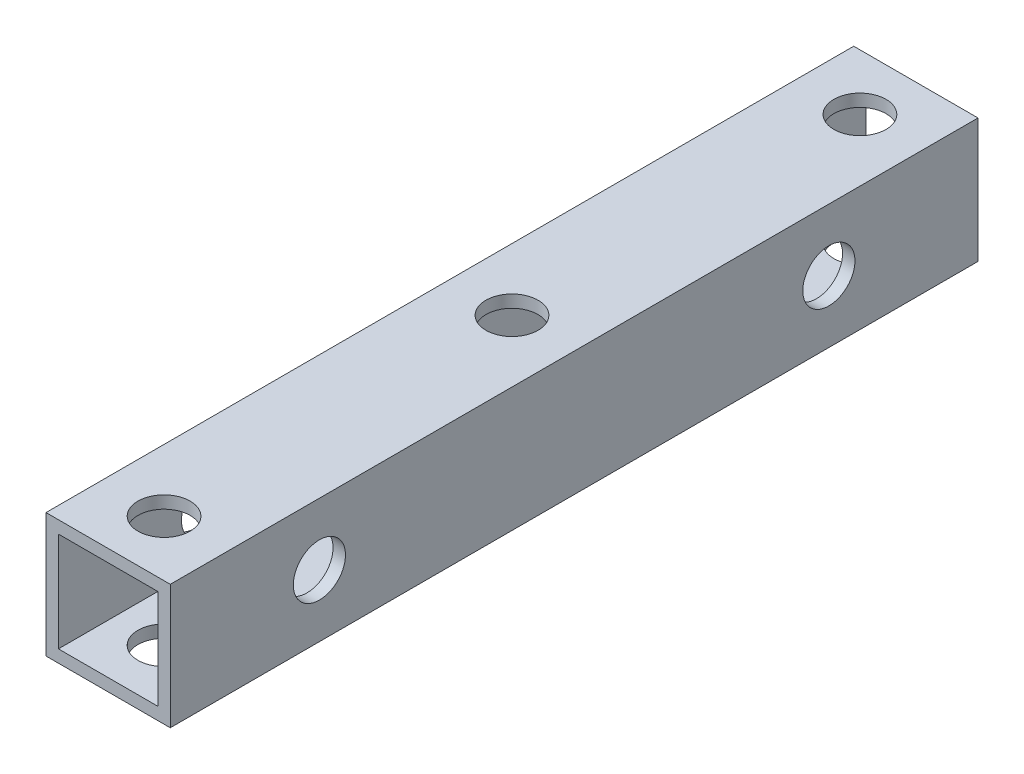
ISO-10303-21;
HEADER;
FILE_DESCRIPTION(('STEP AP214'),'2;1');
FILE_NAME('part.step','',(''),(''),'','','');
FILE_SCHEMA(('AUTOMOTIVE_DESIGN { 1 0 10303 214 1 1 1 1 }'));
ENDSEC;
DATA;
#1=APPLICATION_CONTEXT('core data for automotive mechanical design processes');
#2=APPLICATION_PROTOCOL_DEFINITION('international standard','automotive_design',2000,#1);
#3=PRODUCT_CONTEXT('',#1,'mechanical');
#4=PRODUCT('Part','Part','',(#3));
#5=PRODUCT_RELATED_PRODUCT_CATEGORY('part','',(#4));
#6=PRODUCT_DEFINITION_FORMATION('','',#4);
#7=PRODUCT_DEFINITION_CONTEXT('part definition',#1,'design');
#8=PRODUCT_DEFINITION('design','',#6,#7);
#9=PRODUCT_DEFINITION_SHAPE('','',#8);
#10=(LENGTH_UNIT() NAMED_UNIT(*) SI_UNIT(.MILLI.,.METRE.));
#11=(NAMED_UNIT(*) PLANE_ANGLE_UNIT() SI_UNIT($,.RADIAN.));
#12=(NAMED_UNIT(*) SI_UNIT($,.STERADIAN.) SOLID_ANGLE_UNIT());
#13=UNCERTAINTY_MEASURE_WITH_UNIT(LENGTH_MEASURE(1.E-05),#10,'distance_accuracy_value','');
#14=(GEOMETRIC_REPRESENTATION_CONTEXT(3) GLOBAL_UNCERTAINTY_ASSIGNED_CONTEXT((#13)) GLOBAL_UNIT_ASSIGNED_CONTEXT((#10,
#11,#12)) REPRESENTATION_CONTEXT('',''));
#15=CARTESIAN_POINT('',(0.,0.,0.));
#16=DIRECTION('',(0.,0.,1.));
#17=DIRECTION('',(1.,0.,0.));
#18=AXIS2_PLACEMENT_3D('',#15,#16,#17);
#19=CARTESIAN_POINT('',(-5.,5.,65.));
#20=DIRECTION('',(0.,-1.,0.));
#21=DIRECTION('',(0.,0.,-1.));
#22=AXIS2_PLACEMENT_3D('',#19,#20,#21);
#23=PLANE('',#22);
#24=CARTESIAN_POINT('',(0.,5.,4.5));
#25=DIRECTION('',(0.,1.,0.));
#26=DIRECTION('',(0.,0.,1.));
#27=AXIS2_PLACEMENT_3D('',#24,#25,#26);
#28=CIRCLE('',#27,2.1);
#29=CARTESIAN_POINT('',(0.,5.,6.6));
#30=VERTEX_POINT('',#29);
#31=EDGE_CURVE('E171',#30,#30,#28,.T.);
#32=ORIENTED_EDGE('',*,*,#31,.F.);
#33=EDGE_LOOP('',(#32));
#34=FACE_BOUND('',#33,.T.);
#35=CARTESIAN_POINT('',(0.,5.,32.5));
#36=DIRECTION('',(0.,1.,0.));
#37=DIRECTION('',(0.,0.,1.));
#38=AXIS2_PLACEMENT_3D('',#35,#36,#37);
#39=CIRCLE('',#38,2.1);
#40=CARTESIAN_POINT('',(0.,5.,34.6));
#41=VERTEX_POINT('',#40);
#42=EDGE_CURVE('E207',#41,#41,#39,.T.);
#43=ORIENTED_EDGE('',*,*,#42,.F.);
#44=EDGE_LOOP('',(#43));
#45=FACE_BOUND('',#44,.T.);
#46=DIRECTION('',(-1.,0.,0.));
#47=VECTOR('',#46,1.);
#48=CARTESIAN_POINT('',(-5.,5.,0.));
#49=LINE('',#48,#47);
#50=CARTESIAN_POINT('',(5.,5.,0.));
#51=VERTEX_POINT('',#50);
#52=CARTESIAN_POINT('',(-5.,5.,0.));
#53=VERTEX_POINT('',#52);
#54=EDGE_CURVE('E155',#51,#53,#49,.T.);
#55=ORIENTED_EDGE('',*,*,#54,.T.);
#56=DIRECTION('',(0.,0.,-1.));
#57=VECTOR('',#56,1.);
#58=CARTESIAN_POINT('',(-5.,5.,65.));
#59=LINE('',#58,#57);
#60=CARTESIAN_POINT('',(-5.,5.,65.));
#61=VERTEX_POINT('',#60);
#62=EDGE_CURVE('E44',#61,#53,#59,.T.);
#63=ORIENTED_EDGE('',*,*,#62,.F.);
#64=DIRECTION('',(-1.,0.,0.));
#65=VECTOR('',#64,1.);
#66=CARTESIAN_POINT('',(-5.,5.,65.));
#67=LINE('',#66,#65);
#68=CARTESIAN_POINT('',(5.,5.,65.));
#69=VERTEX_POINT('',#68);
#70=EDGE_CURVE('E145',#69,#61,#67,.T.);
#71=ORIENTED_EDGE('',*,*,#70,.F.);
#72=DIRECTION('',(0.,0.,-1.));
#73=VECTOR('',#72,1.);
#74=CARTESIAN_POINT('',(5.,5.,65.));
#75=LINE('',#74,#73);
#76=EDGE_CURVE('E11',#69,#51,#75,.T.);
#77=ORIENTED_EDGE('',*,*,#76,.T.);
#78=EDGE_LOOP('',(#55,#63,#71,#77));
#79=FACE_BOUND('',#78,.T.);
#80=CARTESIAN_POINT('',(0.,5.,60.5));
#81=DIRECTION('',(0.,-1.,0.));
#82=DIRECTION('',(0.,0.,-1.));
#83=AXIS2_PLACEMENT_3D('',#80,#81,#82);
#84=CIRCLE('',#83,2.1);
#85=CARTESIAN_POINT('',(0.,5.,58.4));
#86=VERTEX_POINT('',#85);
#87=EDGE_CURVE('E180',#86,#86,#84,.T.);
#88=ORIENTED_EDGE('',*,*,#87,.T.);
#89=EDGE_LOOP('',(#88));
#90=FACE_BOUND('',#89,.T.);
#91=ADVANCED_FACE('F35',(#34,#45,#79,#90),#23,.F.);
#92=CARTESIAN_POINT('',(-5.,-5.,65.));
#93=DIRECTION('',(0.,1.,0.));
#94=DIRECTION('',(0.,0.,1.));
#95=AXIS2_PLACEMENT_3D('',#92,#93,#94);
#96=PLANE('',#95);
#97=CARTESIAN_POINT('',(0.,-5.,4.5));
#98=DIRECTION('',(0.,1.,0.));
#99=DIRECTION('',(0.,0.,1.));
#100=AXIS2_PLACEMENT_3D('',#97,#98,#99);
#101=CIRCLE('',#100,2.1);
#102=CARTESIAN_POINT('',(0.,-5.,6.6));
#103=VERTEX_POINT('',#102);
#104=EDGE_CURVE('E132',#103,#103,#101,.T.);
#105=ORIENTED_EDGE('',*,*,#104,.T.);
#106=EDGE_LOOP('',(#105));
#107=FACE_BOUND('',#106,.T.);
#108=CARTESIAN_POINT('',(0.,-5.,32.5));
#109=DIRECTION('',(0.,1.,0.));
#110=DIRECTION('',(0.,0.,1.));
#111=AXIS2_PLACEMENT_3D('',#108,#109,#110);
#112=CIRCLE('',#111,2.1);
#113=CARTESIAN_POINT('',(0.,-5.,34.6));
#114=VERTEX_POINT('',#113);
#115=EDGE_CURVE('E176',#114,#114,#112,.T.);
#116=ORIENTED_EDGE('',*,*,#115,.T.);
#117=EDGE_LOOP('',(#116));
#118=FACE_BOUND('',#117,.T.);
#119=DIRECTION('',(1.,0.,0.));
#120=VECTOR('',#119,1.);
#121=CARTESIAN_POINT('',(-5.,-5.,0.));
#122=LINE('',#121,#120);
#123=CARTESIAN_POINT('',(-5.,-5.,0.));
#124=VERTEX_POINT('',#123);
#125=CARTESIAN_POINT('',(5.,-5.,0.));
#126=VERTEX_POINT('',#125);
#127=EDGE_CURVE('E146',#124,#126,#122,.T.);
#128=ORIENTED_EDGE('',*,*,#127,.T.);
#129=DIRECTION('',(0.,0.,-1.));
#130=VECTOR('',#129,1.);
#131=CARTESIAN_POINT('',(5.,-5.,65.));
#132=LINE('',#131,#130);
#133=CARTESIAN_POINT('',(5.,-5.,65.));
#134=VERTEX_POINT('',#133);
#135=EDGE_CURVE('E152',#134,#126,#132,.T.);
#136=ORIENTED_EDGE('',*,*,#135,.F.);
#137=DIRECTION('',(1.,0.,0.));
#138=VECTOR('',#137,1.);
#139=CARTESIAN_POINT('',(-5.,-5.,65.));
#140=LINE('',#139,#138);
#141=CARTESIAN_POINT('',(-5.,-5.,65.));
#142=VERTEX_POINT('',#141);
#143=EDGE_CURVE('E150',#142,#134,#140,.T.);
#144=ORIENTED_EDGE('',*,*,#143,.F.);
#145=DIRECTION('',(0.,0.,-1.));
#146=VECTOR('',#145,1.);
#147=CARTESIAN_POINT('',(-5.,-5.,65.));
#148=LINE('',#147,#146);
#149=EDGE_CURVE('E162',#142,#124,#148,.T.);
#150=ORIENTED_EDGE('',*,*,#149,.T.);
#151=EDGE_LOOP('',(#128,#136,#144,#150));
#152=FACE_BOUND('',#151,.T.);
#153=CARTESIAN_POINT('',(0.,-5.,60.5));
#154=DIRECTION('',(0.,1.,0.));
#155=DIRECTION('',(0.,0.,1.));
#156=AXIS2_PLACEMENT_3D('',#153,#154,#155);
#157=CIRCLE('',#156,2.1);
#158=CARTESIAN_POINT('',(0.,-5.,62.6));
#159=VERTEX_POINT('',#158);
#160=EDGE_CURVE('E204',#159,#159,#157,.F.);
#161=ORIENTED_EDGE('',*,*,#160,.F.);
#162=EDGE_LOOP('',(#161));
#163=FACE_BOUND('',#162,.T.);
#164=ADVANCED_FACE('F220',(#107,#118,#152,#163),#96,.F.);
#165=CARTESIAN_POINT('',(-4.,4.,65.));
#166=DIRECTION('',(0.,-1.,0.));
#167=DIRECTION('',(0.,0.,-1.));
#168=AXIS2_PLACEMENT_3D('',#165,#166,#167);
#169=PLANE('',#168);
#170=DIRECTION('',(-1.,0.,0.));
#171=VECTOR('',#170,1.);
#172=CARTESIAN_POINT('',(-4.,4.,0.));
#173=LINE('',#172,#171);
#174=CARTESIAN_POINT('',(4.,4.,0.));
#175=VERTEX_POINT('',#174);
#176=CARTESIAN_POINT('',(-4.,4.,0.));
#177=VERTEX_POINT('',#176);
#178=EDGE_CURVE('E118',#175,#177,#173,.T.);
#179=ORIENTED_EDGE('',*,*,#178,.F.);
#180=DIRECTION('',(0.,0.,-1.));
#181=VECTOR('',#180,1.);
#182=CARTESIAN_POINT('',(4.,4.,65.));
#183=LINE('',#182,#181);
#184=CARTESIAN_POINT('',(4.,4.,65.));
#185=VERTEX_POINT('',#184);
#186=EDGE_CURVE('E105',#185,#175,#183,.T.);
#187=ORIENTED_EDGE('',*,*,#186,.F.);
#188=DIRECTION('',(-1.,0.,0.));
#189=VECTOR('',#188,1.);
#190=CARTESIAN_POINT('',(-4.,4.,65.));
#191=LINE('',#190,#189);
#192=CARTESIAN_POINT('',(-4.,4.,65.));
#193=VERTEX_POINT('',#192);
#194=EDGE_CURVE('E110',#185,#193,#191,.T.);
#195=ORIENTED_EDGE('',*,*,#194,.T.);
#196=DIRECTION('',(0.,0.,-1.));
#197=VECTOR('',#196,1.);
#198=CARTESIAN_POINT('',(-4.,4.,65.));
#199=LINE('',#198,#197);
#200=EDGE_CURVE('E120',#193,#177,#199,.T.);
#201=ORIENTED_EDGE('',*,*,#200,.T.);
#202=EDGE_LOOP('',(#179,#187,#195,#201));
#203=FACE_BOUND('',#202,.T.);
#204=CARTESIAN_POINT('',(0.,4.,32.5));
#205=DIRECTION('',(0.,-1.,0.));
#206=DIRECTION('',(0.,0.,-1.));
#207=AXIS2_PLACEMENT_3D('',#204,#205,#206);
#208=CIRCLE('',#207,2.1);
#209=CARTESIAN_POINT('',(0.,4.,30.4));
#210=VERTEX_POINT('',#209);
#211=EDGE_CURVE('E170',#210,#210,#208,.T.);
#212=ORIENTED_EDGE('',*,*,#211,.F.);
#213=EDGE_LOOP('',(#212));
#214=FACE_BOUND('',#213,.T.);
#215=CARTESIAN_POINT('',(0.,4.,4.5));
#216=DIRECTION('',(0.,-1.,0.));
#217=DIRECTION('',(0.,0.,-1.));
#218=AXIS2_PLACEMENT_3D('',#215,#216,#217);
#219=CIRCLE('',#218,2.1);
#220=CARTESIAN_POINT('',(0.,4.,2.4));
#221=VERTEX_POINT('',#220);
#222=EDGE_CURVE('E175',#221,#221,#219,.T.);
#223=ORIENTED_EDGE('',*,*,#222,.F.);
#224=EDGE_LOOP('',(#223));
#225=FACE_BOUND('',#224,.T.);
#226=CARTESIAN_POINT('',(0.,4.,60.5));
#227=DIRECTION('',(0.,-1.,0.));
#228=DIRECTION('',(0.,0.,-1.));
#229=AXIS2_PLACEMENT_3D('',#226,#227,#228);
#230=CIRCLE('',#229,2.1);
#231=CARTESIAN_POINT('',(0.,4.,58.4));
#232=VERTEX_POINT('',#231);
#233=EDGE_CURVE('E179',#232,#232,#230,.F.);
#234=ORIENTED_EDGE('',*,*,#233,.T.);
#235=EDGE_LOOP('',(#234));
#236=FACE_BOUND('',#235,.T.);
#237=ADVANCED_FACE('F114',(#203,#214,#225,#236),#169,.T.);
#238=CARTESIAN_POINT('',(-4.,-4.,65.));
#239=DIRECTION('',(0.,1.,0.));
#240=DIRECTION('',(0.,0.,1.));
#241=AXIS2_PLACEMENT_3D('',#238,#239,#240);
#242=PLANE('',#241);
#243=DIRECTION('',(1.,0.,0.));
#244=VECTOR('',#243,1.);
#245=CARTESIAN_POINT('',(-4.,-4.,0.));
#246=LINE('',#245,#244);
#247=CARTESIAN_POINT('',(-4.,-4.,0.));
#248=VERTEX_POINT('',#247);
#249=CARTESIAN_POINT('',(4.,-4.,0.));
#250=VERTEX_POINT('',#249);
#251=EDGE_CURVE('E111',#248,#250,#246,.T.);
#252=ORIENTED_EDGE('',*,*,#251,.F.);
#253=DIRECTION('',(0.,0.,-1.));
#254=VECTOR('',#253,1.);
#255=CARTESIAN_POINT('',(-4.,-4.,65.));
#256=LINE('',#255,#254);
#257=CARTESIAN_POINT('',(-4.,-4.,65.));
#258=VERTEX_POINT('',#257);
#259=EDGE_CURVE('E52',#258,#248,#256,.T.);
#260=ORIENTED_EDGE('',*,*,#259,.F.);
#261=DIRECTION('',(1.,0.,0.));
#262=VECTOR('',#261,1.);
#263=CARTESIAN_POINT('',(-4.,-4.,65.));
#264=LINE('',#263,#262);
#265=CARTESIAN_POINT('',(4.,-4.,65.));
#266=VERTEX_POINT('',#265);
#267=EDGE_CURVE('E126',#258,#266,#264,.T.);
#268=ORIENTED_EDGE('',*,*,#267,.T.);
#269=DIRECTION('',(0.,0.,-1.));
#270=VECTOR('',#269,1.);
#271=CARTESIAN_POINT('',(4.,-4.,65.));
#272=LINE('',#271,#270);
#273=EDGE_CURVE('E106',#266,#250,#272,.T.);
#274=ORIENTED_EDGE('',*,*,#273,.T.);
#275=EDGE_LOOP('',(#252,#260,#268,#274));
#276=FACE_BOUND('',#275,.T.);
#277=CARTESIAN_POINT('',(0.,-4.,32.5));
#278=DIRECTION('',(0.,1.,0.));
#279=DIRECTION('',(0.,0.,1.));
#280=AXIS2_PLACEMENT_3D('',#277,#278,#279);
#281=CIRCLE('',#280,2.1);
#282=CARTESIAN_POINT('',(0.,-4.,34.6));
#283=VERTEX_POINT('',#282);
#284=EDGE_CURVE('E167',#283,#283,#281,.T.);
#285=ORIENTED_EDGE('',*,*,#284,.F.);
#286=EDGE_LOOP('',(#285));
#287=FACE_BOUND('',#286,.T.);
#288=CARTESIAN_POINT('',(0.,-4.,4.5));
#289=DIRECTION('',(0.,1.,0.));
#290=DIRECTION('',(0.,0.,1.));
#291=AXIS2_PLACEMENT_3D('',#288,#289,#290);
#292=CIRCLE('',#291,2.1);
#293=CARTESIAN_POINT('',(0.,-4.,6.6));
#294=VERTEX_POINT('',#293);
#295=EDGE_CURVE('E172',#294,#294,#292,.T.);
#296=ORIENTED_EDGE('',*,*,#295,.F.);
#297=EDGE_LOOP('',(#296));
#298=FACE_BOUND('',#297,.T.);
#299=CARTESIAN_POINT('',(0.,-4.,60.5));
#300=DIRECTION('',(0.,1.,0.));
#301=DIRECTION('',(0.,0.,1.));
#302=AXIS2_PLACEMENT_3D('',#299,#300,#301);
#303=CIRCLE('',#302,2.1);
#304=CARTESIAN_POINT('',(0.,-4.,62.6));
#305=VERTEX_POINT('',#304);
#306=EDGE_CURVE('E177',#305,#305,#303,.F.);
#307=ORIENTED_EDGE('',*,*,#306,.T.);
#308=EDGE_LOOP('',(#307));
#309=FACE_BOUND('',#308,.T.);
#310=ADVANCED_FACE('F261',(#276,#287,#298,#309),#242,.T.);
#311=CARTESIAN_POINT('',(0.,0.,65.));
#312=DIRECTION('',(0.,0.,1.));
#313=DIRECTION('',(1.,0.,0.));
#314=AXIS2_PLACEMENT_3D('',#311,#312,#313);
#315=PLANE('',#314);
#316=DIRECTION('',(0.,1.,0.));
#317=VECTOR('',#316,1.);
#318=CARTESIAN_POINT('',(5.,5.,65.));
#319=LINE('',#318,#317);
#320=EDGE_CURVE('E142',#134,#69,#319,.T.);
#321=ORIENTED_EDGE('',*,*,#320,.T.);
#322=ORIENTED_EDGE('',*,*,#70,.T.);
#323=DIRECTION('',(0.,-1.,0.));
#324=VECTOR('',#323,1.);
#325=CARTESIAN_POINT('',(-5.,5.,65.));
#326=LINE('',#325,#324);
#327=EDGE_CURVE('E148',#61,#142,#326,.T.);
#328=ORIENTED_EDGE('',*,*,#327,.T.);
#329=ORIENTED_EDGE('',*,*,#143,.T.);
#330=EDGE_LOOP('',(#321,#322,#328,#329));
#331=FACE_BOUND('',#330,.T.);
#332=ORIENTED_EDGE('',*,*,#194,.F.);
#333=DIRECTION('',(0.,1.,0.));
#334=VECTOR('',#333,1.);
#335=CARTESIAN_POINT('',(4.,4.,65.));
#336=LINE('',#335,#334);
#337=EDGE_CURVE('E102',#266,#185,#336,.T.);
#338=ORIENTED_EDGE('',*,*,#337,.F.);
#339=ORIENTED_EDGE('',*,*,#267,.F.);
#340=DIRECTION('',(0.,-1.,0.));
#341=VECTOR('',#340,1.);
#342=CARTESIAN_POINT('',(-4.,4.,65.));
#343=LINE('',#342,#341);
#344=EDGE_CURVE('E124',#193,#258,#343,.T.);
#345=ORIENTED_EDGE('',*,*,#344,.F.);
#346=EDGE_LOOP('',(#332,#338,#339,#345));
#347=FACE_BOUND('',#346,.T.);
#348=ADVANCED_FACE('F123',(#331,#347),#315,.T.);
#349=CARTESIAN_POINT('',(0.,0.,0.));
#350=DIRECTION('',(0.,0.,1.));
#351=DIRECTION('',(1.,0.,0.));
#352=AXIS2_PLACEMENT_3D('',#349,#350,#351);
#353=PLANE('',#352);
#354=DIRECTION('',(0.,1.,0.));
#355=VECTOR('',#354,1.);
#356=CARTESIAN_POINT('',(5.,5.,0.));
#357=LINE('',#356,#355);
#358=EDGE_CURVE('E119',#126,#51,#357,.T.);
#359=ORIENTED_EDGE('',*,*,#358,.F.);
#360=ORIENTED_EDGE('',*,*,#127,.F.);
#361=DIRECTION('',(0.,-1.,0.));
#362=VECTOR('',#361,1.);
#363=CARTESIAN_POINT('',(-5.,5.,0.));
#364=LINE('',#363,#362);
#365=EDGE_CURVE('E157',#53,#124,#364,.T.);
#366=ORIENTED_EDGE('',*,*,#365,.F.);
#367=ORIENTED_EDGE('',*,*,#54,.F.);
#368=EDGE_LOOP('',(#359,#360,#366,#367));
#369=FACE_BOUND('',#368,.T.);
#370=DIRECTION('',(0.,1.,0.));
#371=VECTOR('',#370,1.);
#372=CARTESIAN_POINT('',(4.,4.,0.));
#373=LINE('',#372,#371);
#374=EDGE_CURVE('E60',#250,#175,#373,.T.);
#375=ORIENTED_EDGE('',*,*,#374,.T.);
#376=ORIENTED_EDGE('',*,*,#178,.T.);
#377=DIRECTION('',(0.,-1.,0.));
#378=VECTOR('',#377,1.);
#379=CARTESIAN_POINT('',(-4.,4.,0.));
#380=LINE('',#379,#378);
#381=EDGE_CURVE('E134',#177,#248,#380,.T.);
#382=ORIENTED_EDGE('',*,*,#381,.T.);
#383=ORIENTED_EDGE('',*,*,#251,.T.);
#384=EDGE_LOOP('',(#375,#376,#382,#383));
#385=FACE_BOUND('',#384,.T.);
#386=ADVANCED_FACE('F255',(#369,#385),#353,.F.);
#387=CARTESIAN_POINT('',(5.,5.,65.));
#388=DIRECTION('',(-1.,0.,0.));
#389=DIRECTION('',(0.,0.,1.));
#390=AXIS2_PLACEMENT_3D('',#387,#388,#389);
#391=PLANE('',#390);
#392=CARTESIAN_POINT('',(5.,0.,53.));
#393=DIRECTION('',(1.,0.,0.));
#394=DIRECTION('',(0.,-1.,0.));
#395=AXIS2_PLACEMENT_3D('',#392,#393,#394);
#396=CIRCLE('',#395,2.1);
#397=CARTESIAN_POINT('',(5.,-2.1,53.));
#398=VERTEX_POINT('',#397);
#399=EDGE_CURVE('E311',#398,#398,#396,.T.);
#400=ORIENTED_EDGE('',*,*,#399,.F.);
#401=EDGE_LOOP('',(#400));
#402=FACE_BOUND('',#401,.T.);
#403=CARTESIAN_POINT('',(5.,0.,12.));
#404=DIRECTION('',(-1.,0.,0.));
#405=DIRECTION('',(0.,-1.,0.));
#406=AXIS2_PLACEMENT_3D('',#403,#404,#405);
#407=CIRCLE('',#406,2.1);
#408=CARTESIAN_POINT('',(5.,-2.1,12.));
#409=VERTEX_POINT('',#408);
#410=EDGE_CURVE('E184',#409,#409,#407,.T.);
#411=ORIENTED_EDGE('',*,*,#410,.T.);
#412=EDGE_LOOP('',(#411));
#413=FACE_BOUND('',#412,.T.);
#414=ORIENTED_EDGE('',*,*,#358,.T.);
#415=ORIENTED_EDGE('',*,*,#76,.F.);
#416=ORIENTED_EDGE('',*,*,#320,.F.);
#417=ORIENTED_EDGE('',*,*,#135,.T.);
#418=EDGE_LOOP('',(#414,#415,#416,#417));
#419=FACE_BOUND('',#418,.T.);
#420=ADVANCED_FACE('F37',(#402,#413,#419),#391,.F.);
#421=CARTESIAN_POINT('',(-5.,5.,65.));
#422=DIRECTION('',(1.,0.,0.));
#423=DIRECTION('',(0.,1.,0.));
#424=AXIS2_PLACEMENT_3D('',#421,#422,#423);
#425=PLANE('',#424);
#426=CARTESIAN_POINT('',(-5.,0.,53.));
#427=DIRECTION('',(1.,0.,0.));
#428=DIRECTION('',(0.,-1.,0.));
#429=AXIS2_PLACEMENT_3D('',#426,#427,#428);
#430=CIRCLE('',#429,2.1);
#431=CARTESIAN_POINT('',(-5.,-2.1,53.));
#432=VERTEX_POINT('',#431);
#433=EDGE_CURVE('E310',#432,#432,#430,.T.);
#434=ORIENTED_EDGE('',*,*,#433,.T.);
#435=EDGE_LOOP('',(#434));
#436=FACE_BOUND('',#435,.T.);
#437=CARTESIAN_POINT('',(-5.,0.,12.));
#438=DIRECTION('',(-1.,0.,0.));
#439=DIRECTION('',(0.,-1.,0.));
#440=AXIS2_PLACEMENT_3D('',#437,#438,#439);
#441=CIRCLE('',#440,2.1);
#442=CARTESIAN_POINT('',(-5.,-2.1,12.));
#443=VERTEX_POINT('',#442);
#444=EDGE_CURVE('E190',#443,#443,#441,.T.);
#445=ORIENTED_EDGE('',*,*,#444,.F.);
#446=EDGE_LOOP('',(#445));
#447=FACE_BOUND('',#446,.T.);
#448=ORIENTED_EDGE('',*,*,#365,.T.);
#449=ORIENTED_EDGE('',*,*,#149,.F.);
#450=ORIENTED_EDGE('',*,*,#327,.F.);
#451=ORIENTED_EDGE('',*,*,#62,.T.);
#452=EDGE_LOOP('',(#448,#449,#450,#451));
#453=FACE_BOUND('',#452,.T.);
#454=ADVANCED_FACE('F251',(#436,#447,#453),#425,.F.);
#455=CARTESIAN_POINT('',(4.,4.,65.));
#456=DIRECTION('',(-1.,0.,0.));
#457=DIRECTION('',(0.,-1.,0.));
#458=AXIS2_PLACEMENT_3D('',#455,#456,#457);
#459=PLANE('',#458);
#460=CARTESIAN_POINT('',(4.,0.,53.));
#461=DIRECTION('',(-1.,0.,0.));
#462=DIRECTION('',(0.,-1.,0.));
#463=AXIS2_PLACEMENT_3D('',#460,#461,#462);
#464=CIRCLE('',#463,2.1);
#465=CARTESIAN_POINT('',(4.,-2.1,53.));
#466=VERTEX_POINT('',#465);
#467=EDGE_CURVE('E195',#466,#466,#464,.F.);
#468=ORIENTED_EDGE('',*,*,#467,.T.);
#469=EDGE_LOOP('',(#468));
#470=FACE_BOUND('',#469,.T.);
#471=CARTESIAN_POINT('',(4.,0.,12.));
#472=DIRECTION('',(-1.,0.,0.));
#473=DIRECTION('',(0.,-1.,0.));
#474=AXIS2_PLACEMENT_3D('',#471,#472,#473);
#475=CIRCLE('',#474,2.1);
#476=CARTESIAN_POINT('',(4.,-2.1,12.));
#477=VERTEX_POINT('',#476);
#478=EDGE_CURVE('E183',#477,#477,#475,.T.);
#479=ORIENTED_EDGE('',*,*,#478,.F.);
#480=EDGE_LOOP('',(#479));
#481=FACE_BOUND('',#480,.T.);
#482=ORIENTED_EDGE('',*,*,#374,.F.);
#483=ORIENTED_EDGE('',*,*,#273,.F.);
#484=ORIENTED_EDGE('',*,*,#337,.T.);
#485=ORIENTED_EDGE('',*,*,#186,.T.);
#486=EDGE_LOOP('',(#482,#483,#484,#485));
#487=FACE_BOUND('',#486,.T.);
#488=ADVANCED_FACE('F104',(#470,#481,#487),#459,.T.);
#489=CARTESIAN_POINT('',(-4.,4.,65.));
#490=DIRECTION('',(1.,0.,0.));
#491=DIRECTION('',(0.,1.,0.));
#492=AXIS2_PLACEMENT_3D('',#489,#490,#491);
#493=PLANE('',#492);
#494=CARTESIAN_POINT('',(-4.,0.,53.));
#495=DIRECTION('',(1.,0.,0.));
#496=DIRECTION('',(0.,1.,0.));
#497=AXIS2_PLACEMENT_3D('',#494,#495,#496);
#498=CIRCLE('',#497,2.1);
#499=CARTESIAN_POINT('',(-4.,2.1,53.));
#500=VERTEX_POINT('',#499);
#501=EDGE_CURVE('E39',#500,#500,#498,.F.);
#502=ORIENTED_EDGE('',*,*,#501,.T.);
#503=EDGE_LOOP('',(#502));
#504=FACE_BOUND('',#503,.T.);
#505=CARTESIAN_POINT('',(-4.,0.,12.));
#506=DIRECTION('',(1.,0.,0.));
#507=DIRECTION('',(0.,1.,0.));
#508=AXIS2_PLACEMENT_3D('',#505,#506,#507);
#509=CIRCLE('',#508,2.1);
#510=CARTESIAN_POINT('',(-4.,2.1,12.));
#511=VERTEX_POINT('',#510);
#512=EDGE_CURVE('E181',#511,#511,#509,.T.);
#513=ORIENTED_EDGE('',*,*,#512,.F.);
#514=EDGE_LOOP('',(#513));
#515=FACE_BOUND('',#514,.T.);
#516=ORIENTED_EDGE('',*,*,#381,.F.);
#517=ORIENTED_EDGE('',*,*,#200,.F.);
#518=ORIENTED_EDGE('',*,*,#344,.T.);
#519=ORIENTED_EDGE('',*,*,#259,.T.);
#520=EDGE_LOOP('',(#516,#517,#518,#519));
#521=FACE_BOUND('',#520,.T.);
#522=ADVANCED_FACE('F236',(#504,#515,#521),#493,.T.);
#523=CARTESIAN_POINT('',(0.,-55.,32.5));
#524=DIRECTION('',(0.,1.,0.));
#525=DIRECTION('',(0.,0.,1.));
#526=AXIS2_PLACEMENT_3D('',#523,#524,#525);
#527=CYLINDRICAL_SURFACE('',#526,2.1);
#528=ORIENTED_EDGE('',*,*,#284,.T.);
#529=EDGE_LOOP('',(#528));
#530=FACE_BOUND('',#529,.T.);
#531=ORIENTED_EDGE('',*,*,#115,.F.);
#532=EDGE_LOOP('',(#531));
#533=FACE_BOUND('',#532,.T.);
#534=ADVANCED_FACE('F226',(#530,#533),#527,.F.);
#535=CARTESIAN_POINT('',(0.,-55.,4.5));
#536=DIRECTION('',(0.,1.,0.));
#537=DIRECTION('',(0.,0.,1.));
#538=AXIS2_PLACEMENT_3D('',#535,#536,#537);
#539=CYLINDRICAL_SURFACE('',#538,2.1);
#540=ORIENTED_EDGE('',*,*,#295,.T.);
#541=EDGE_LOOP('',(#540));
#542=FACE_BOUND('',#541,.T.);
#543=ORIENTED_EDGE('',*,*,#104,.F.);
#544=EDGE_LOOP('',(#543));
#545=FACE_BOUND('',#544,.T.);
#546=ADVANCED_FACE('F223',(#542,#545),#539,.F.);
#547=ORIENTED_EDGE('',*,*,#211,.T.);
#548=EDGE_LOOP('',(#547));
#549=FACE_BOUND('',#548,.T.);
#550=ORIENTED_EDGE('',*,*,#42,.T.);
#551=EDGE_LOOP('',(#550));
#552=FACE_BOUND('',#551,.T.);
#553=ADVANCED_FACE('F225',(#549,#552),#527,.F.);
#554=ORIENTED_EDGE('',*,*,#222,.T.);
#555=EDGE_LOOP('',(#554));
#556=FACE_BOUND('',#555,.T.);
#557=ORIENTED_EDGE('',*,*,#31,.T.);
#558=EDGE_LOOP('',(#557));
#559=FACE_BOUND('',#558,.T.);
#560=ADVANCED_FACE('F229',(#556,#559),#539,.F.);
#561=CARTESIAN_POINT('',(0.,-55.,60.5));
#562=DIRECTION('',(0.,1.,0.));
#563=DIRECTION('',(0.,0.,1.));
#564=AXIS2_PLACEMENT_3D('',#561,#562,#563);
#565=CYLINDRICAL_SURFACE('',#564,2.1);
#566=ORIENTED_EDGE('',*,*,#306,.F.);
#567=EDGE_LOOP('',(#566));
#568=FACE_BOUND('',#567,.T.);
#569=ORIENTED_EDGE('',*,*,#160,.T.);
#570=EDGE_LOOP('',(#569));
#571=FACE_BOUND('',#570,.T.);
#572=ADVANCED_FACE('F240',(#568,#571),#565,.F.);
#573=ORIENTED_EDGE('',*,*,#233,.F.);
#574=EDGE_LOOP('',(#573));
#575=FACE_BOUND('',#574,.T.);
#576=ORIENTED_EDGE('',*,*,#87,.F.);
#577=EDGE_LOOP('',(#576));
#578=FACE_BOUND('',#577,.T.);
#579=ADVANCED_FACE('F283',(#575,#578),#565,.F.);
#580=CARTESIAN_POINT('',(5.,0.,12.));
#581=DIRECTION('',(-1.,0.,0.));
#582=DIRECTION('',(0.,-1.,0.));
#583=AXIS2_PLACEMENT_3D('',#580,#581,#582);
#584=CYLINDRICAL_SURFACE('',#583,2.1);
#585=ORIENTED_EDGE('',*,*,#512,.T.);
#586=EDGE_LOOP('',(#585));
#587=FACE_BOUND('',#586,.T.);
#588=ORIENTED_EDGE('',*,*,#444,.T.);
#589=EDGE_LOOP('',(#588));
#590=FACE_BOUND('',#589,.T.);
#591=ADVANCED_FACE('F289',(#587,#590),#584,.F.);
#592=ORIENTED_EDGE('',*,*,#478,.T.);
#593=EDGE_LOOP('',(#592));
#594=FACE_BOUND('',#593,.T.);
#595=ORIENTED_EDGE('',*,*,#410,.F.);
#596=EDGE_LOOP('',(#595));
#597=FACE_BOUND('',#596,.T.);
#598=ADVANCED_FACE('F294',(#594,#597),#584,.F.);
#599=CARTESIAN_POINT('',(5.,0.,53.));
#600=DIRECTION('',(-1.,0.,0.));
#601=DIRECTION('',(0.,-1.,0.));
#602=AXIS2_PLACEMENT_3D('',#599,#600,#601);
#603=CYLINDRICAL_SURFACE('',#602,2.1);
#604=ORIENTED_EDGE('',*,*,#501,.F.);
#605=EDGE_LOOP('',(#604));
#606=FACE_BOUND('',#605,.T.);
#607=ORIENTED_EDGE('',*,*,#433,.F.);
#608=EDGE_LOOP('',(#607));
#609=FACE_BOUND('',#608,.T.);
#610=ADVANCED_FACE('F295',(#606,#609),#603,.F.);
#611=ORIENTED_EDGE('',*,*,#467,.F.);
#612=EDGE_LOOP('',(#611));
#613=FACE_BOUND('',#612,.T.);
#614=ORIENTED_EDGE('',*,*,#399,.T.);
#615=EDGE_LOOP('',(#614));
#616=FACE_BOUND('',#615,.T.);
#617=ADVANCED_FACE('F297',(#613,#616),#603,.F.);
#618=CLOSED_SHELL('',(#91,#164,#237,#310,#348,#386,#420,#454,#488,#522,#534,#546,#553,#560,#572,
#579,#591,#598,#610,#617));
#619=MANIFOLD_SOLID_BREP('B2',#618);
#620=ADVANCED_BREP_SHAPE_REPRESENTATION('',(#18,#619),#14);
#621=SHAPE_DEFINITION_REPRESENTATION(#9,#620);
ENDSEC;
END-ISO-10303-21;
